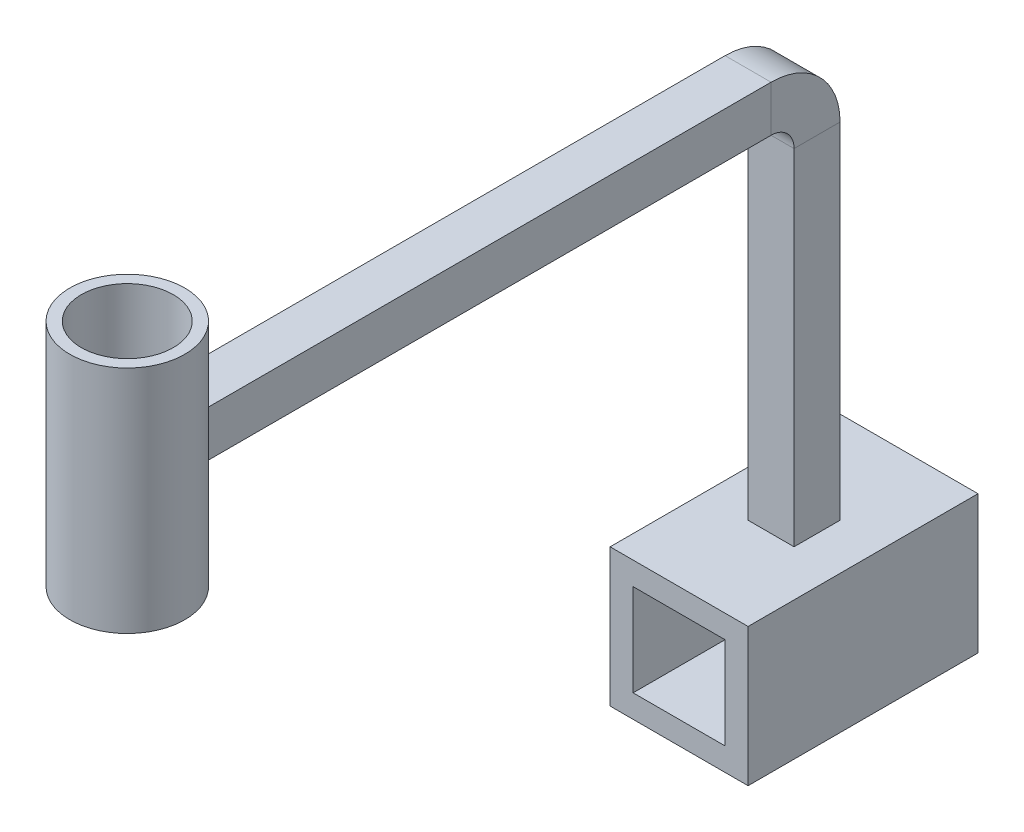
ISO-10303-21;
HEADER;
FILE_DESCRIPTION(('STEP AP214'),'2;1');
FILE_NAME('part.step','',(''),(''),'','','');
FILE_SCHEMA(('AUTOMOTIVE_DESIGN { 1 0 10303 214 1 1 1 1 }'));
ENDSEC;
DATA;
#1=APPLICATION_CONTEXT('core data for automotive mechanical design processes');
#2=APPLICATION_PROTOCOL_DEFINITION('international standard','automotive_design',2000,#1);
#3=PRODUCT_CONTEXT('',#1,'mechanical');
#4=PRODUCT('Part','Part','',(#3));
#5=PRODUCT_RELATED_PRODUCT_CATEGORY('part','',(#4));
#6=PRODUCT_DEFINITION_FORMATION('','',#4);
#7=PRODUCT_DEFINITION_CONTEXT('part definition',#1,'design');
#8=PRODUCT_DEFINITION('design','',#6,#7);
#9=PRODUCT_DEFINITION_SHAPE('','',#8);
#10=(LENGTH_UNIT() NAMED_UNIT(*) SI_UNIT(.MILLI.,.METRE.));
#11=(NAMED_UNIT(*) PLANE_ANGLE_UNIT() SI_UNIT($,.RADIAN.));
#12=(NAMED_UNIT(*) SI_UNIT($,.STERADIAN.) SOLID_ANGLE_UNIT());
#13=UNCERTAINTY_MEASURE_WITH_UNIT(LENGTH_MEASURE(1.E-05),#10,'distance_accuracy_value','');
#14=(GEOMETRIC_REPRESENTATION_CONTEXT(3) GLOBAL_UNCERTAINTY_ASSIGNED_CONTEXT((#13)) GLOBAL_UNIT_ASSIGNED_CONTEXT((#10,
#11,#12)) REPRESENTATION_CONTEXT('',''));
#15=CARTESIAN_POINT('',(0.,0.,0.));
#16=DIRECTION('',(0.,0.,1.));
#17=DIRECTION('',(1.,0.,0.));
#18=AXIS2_PLACEMENT_3D('',#15,#16,#17);
#19=CARTESIAN_POINT('',(-3.,3.,10.));
#20=DIRECTION('',(0.,-1.,0.));
#21=DIRECTION('',(0.,0.,-1.));
#22=AXIS2_PLACEMENT_3D('',#19,#20,#21);
#23=PLANE('',#22);
#24=DIRECTION('',(-1.,0.,0.));
#25=VECTOR('',#24,1.);
#26=CARTESIAN_POINT('',(-3.,3.,0.));
#27=LINE('',#26,#25);
#28=CARTESIAN_POINT('',(3.,3.,0.));
#29=VERTEX_POINT('',#28);
#30=CARTESIAN_POINT('',(-3.,3.,0.));
#31=VERTEX_POINT('',#30);
#32=EDGE_CURVE('E290',#29,#31,#27,.T.);
#33=ORIENTED_EDGE('',*,*,#32,.T.);
#34=DIRECTION('',(0.,0.,-1.));
#35=VECTOR('',#34,1.);
#36=CARTESIAN_POINT('',(-3.,3.,10.));
#37=LINE('',#36,#35);
#38=CARTESIAN_POINT('',(-3.,3.,10.));
#39=VERTEX_POINT('',#38);
#40=EDGE_CURVE('E300',#39,#31,#37,.T.);
#41=ORIENTED_EDGE('',*,*,#40,.F.);
#42=DIRECTION('',(-1.,0.,0.));
#43=VECTOR('',#42,1.);
#44=CARTESIAN_POINT('',(-3.,3.,10.));
#45=LINE('',#44,#43);
#46=CARTESIAN_POINT('',(3.,3.,10.));
#47=VERTEX_POINT('',#46);
#48=EDGE_CURVE('E280',#47,#39,#45,.T.);
#49=ORIENTED_EDGE('',*,*,#48,.F.);
#50=DIRECTION('',(0.,0.,-1.));
#51=VECTOR('',#50,1.);
#52=CARTESIAN_POINT('',(3.,3.,10.));
#53=LINE('',#52,#51);
#54=EDGE_CURVE('E53',#47,#29,#53,.T.);
#55=ORIENTED_EDGE('',*,*,#54,.T.);
#56=EDGE_LOOP('',(#33,#41,#49,#55));
#57=FACE_BOUND('',#56,.T.);
#58=DIRECTION('',(0.,0.,1.));
#59=VECTOR('',#58,1.);
#60=CARTESIAN_POINT('',(-0.999999999999999,3.,6.));
#61=LINE('',#60,#59);
#62=CARTESIAN_POINT('',(-0.999999999999999,3.,4.));
#63=VERTEX_POINT('',#62);
#64=CARTESIAN_POINT('',(-0.999999999999999,3.,6.));
#65=VERTEX_POINT('',#64);
#66=EDGE_CURVE('E212',#63,#65,#61,.T.);
#67=ORIENTED_EDGE('',*,*,#66,.F.);
#68=DIRECTION('',(-1.,0.,0.));
#69=VECTOR('',#68,1.);
#70=CARTESIAN_POINT('',(1.,3.,4.));
#71=LINE('',#70,#69);
#72=CARTESIAN_POINT('',(1.,3.,4.));
#73=VERTEX_POINT('',#72);
#74=EDGE_CURVE('E186',#73,#63,#71,.T.);
#75=ORIENTED_EDGE('',*,*,#74,.F.);
#76=DIRECTION('',(0.,0.,-1.));
#77=VECTOR('',#76,1.);
#78=CARTESIAN_POINT('',(1.,3.,6.));
#79=LINE('',#78,#77);
#80=CARTESIAN_POINT('',(1.,3.,6.));
#81=VERTEX_POINT('',#80);
#82=EDGE_CURVE('E172',#81,#73,#79,.T.);
#83=ORIENTED_EDGE('',*,*,#82,.F.);
#84=DIRECTION('',(1.,0.,0.));
#85=VECTOR('',#84,1.);
#86=CARTESIAN_POINT('',(1.,3.,6.));
#87=LINE('',#86,#85);
#88=EDGE_CURVE('E197',#65,#81,#87,.T.);
#89=ORIENTED_EDGE('',*,*,#88,.F.);
#90=EDGE_LOOP('',(#67,#75,#83,#89));
#91=FACE_BOUND('',#90,.T.);
#92=ADVANCED_FACE('F45',(#57,#91),#23,.F.);
#93=CARTESIAN_POINT('',(0.,0.,10.));
#94=DIRECTION('',(0.,0.,1.));
#95=DIRECTION('',(1.,0.,0.));
#96=AXIS2_PLACEMENT_3D('',#93,#94,#95);
#97=PLANE('',#96);
#98=DIRECTION('',(0.,1.,0.));
#99=VECTOR('',#98,1.);
#100=CARTESIAN_POINT('',(3.,3.,10.));
#101=LINE('',#100,#99);
#102=CARTESIAN_POINT('',(3.,-3.,10.));
#103=VERTEX_POINT('',#102);
#104=EDGE_CURVE('E277',#103,#47,#101,.T.);
#105=ORIENTED_EDGE('',*,*,#104,.T.);
#106=ORIENTED_EDGE('',*,*,#48,.T.);
#107=DIRECTION('',(0.,-1.,0.));
#108=VECTOR('',#107,1.);
#109=CARTESIAN_POINT('',(-3.,3.,10.));
#110=LINE('',#109,#108);
#111=CARTESIAN_POINT('',(-3.,-3.,10.));
#112=VERTEX_POINT('',#111);
#113=EDGE_CURVE('E283',#39,#112,#110,.T.);
#114=ORIENTED_EDGE('',*,*,#113,.T.);
#115=DIRECTION('',(1.,0.,0.));
#116=VECTOR('',#115,1.);
#117=CARTESIAN_POINT('',(-3.,-3.,10.));
#118=LINE('',#117,#116);
#119=EDGE_CURVE('E285',#112,#103,#118,.T.);
#120=ORIENTED_EDGE('',*,*,#119,.T.);
#121=EDGE_LOOP('',(#105,#106,#114,#120));
#122=FACE_BOUND('',#121,.T.);
#123=DIRECTION('',(-1.,0.,0.));
#124=VECTOR('',#123,1.);
#125=CARTESIAN_POINT('',(-2.,2.,10.));
#126=LINE('',#125,#124);
#127=CARTESIAN_POINT('',(2.,2.,10.));
#128=VERTEX_POINT('',#127);
#129=CARTESIAN_POINT('',(-2.,2.,10.));
#130=VERTEX_POINT('',#129);
#131=EDGE_CURVE('E248',#128,#130,#126,.T.);
#132=ORIENTED_EDGE('',*,*,#131,.F.);
#133=DIRECTION('',(0.,1.,0.));
#134=VECTOR('',#133,1.);
#135=CARTESIAN_POINT('',(2.,2.,10.));
#136=LINE('',#135,#134);
#137=CARTESIAN_POINT('',(2.,-2.,10.));
#138=VERTEX_POINT('',#137);
#139=EDGE_CURVE('E246',#138,#128,#136,.T.);
#140=ORIENTED_EDGE('',*,*,#139,.F.);
#141=DIRECTION('',(1.,0.,0.));
#142=VECTOR('',#141,1.);
#143=CARTESIAN_POINT('',(-2.,-2.,10.));
#144=LINE('',#143,#142);
#145=CARTESIAN_POINT('',(-2.,-2.,10.));
#146=VERTEX_POINT('',#145);
#147=EDGE_CURVE('E254',#146,#138,#144,.T.);
#148=ORIENTED_EDGE('',*,*,#147,.F.);
#149=DIRECTION('',(0.,-1.,0.));
#150=VECTOR('',#149,1.);
#151=CARTESIAN_POINT('',(-2.,2.,10.));
#152=LINE('',#151,#150);
#153=EDGE_CURVE('E251',#130,#146,#152,.T.);
#154=ORIENTED_EDGE('',*,*,#153,.F.);
#155=EDGE_LOOP('',(#132,#140,#148,#154));
#156=FACE_BOUND('',#155,.T.);
#157=ADVANCED_FACE('F324',(#122,#156),#97,.T.);
#158=CARTESIAN_POINT('',(0.,0.,0.));
#159=DIRECTION('',(0.,0.,1.));
#160=DIRECTION('',(1.,0.,0.));
#161=AXIS2_PLACEMENT_3D('',#158,#159,#160);
#162=PLANE('',#161);
#163=DIRECTION('',(0.,1.,0.));
#164=VECTOR('',#163,1.);
#165=CARTESIAN_POINT('',(3.,3.,0.));
#166=LINE('',#165,#164);
#167=CARTESIAN_POINT('',(3.,-3.,0.));
#168=VERTEX_POINT('',#167);
#169=EDGE_CURVE('E276',#168,#29,#166,.T.);
#170=ORIENTED_EDGE('',*,*,#169,.F.);
#171=DIRECTION('',(1.,0.,0.));
#172=VECTOR('',#171,1.);
#173=CARTESIAN_POINT('',(-3.,-3.,0.));
#174=LINE('',#173,#172);
#175=CARTESIAN_POINT('',(-3.,-3.,0.));
#176=VERTEX_POINT('',#175);
#177=EDGE_CURVE('E281',#176,#168,#174,.T.);
#178=ORIENTED_EDGE('',*,*,#177,.F.);
#179=DIRECTION('',(0.,-1.,0.));
#180=VECTOR('',#179,1.);
#181=CARTESIAN_POINT('',(-3.,3.,0.));
#182=LINE('',#181,#180);
#183=EDGE_CURVE('E292',#31,#176,#182,.T.);
#184=ORIENTED_EDGE('',*,*,#183,.F.);
#185=ORIENTED_EDGE('',*,*,#32,.F.);
#186=EDGE_LOOP('',(#170,#178,#184,#185));
#187=FACE_BOUND('',#186,.T.);
#188=DIRECTION('',(0.,1.,0.));
#189=VECTOR('',#188,1.);
#190=CARTESIAN_POINT('',(2.,2.,0.));
#191=LINE('',#190,#189);
#192=CARTESIAN_POINT('',(2.,-2.,0.));
#193=VERTEX_POINT('',#192);
#194=CARTESIAN_POINT('',(2.,2.,0.));
#195=VERTEX_POINT('',#194);
#196=EDGE_CURVE('E240',#193,#195,#191,.T.);
#197=ORIENTED_EDGE('',*,*,#196,.T.);
#198=DIRECTION('',(-1.,0.,0.));
#199=VECTOR('',#198,1.);
#200=CARTESIAN_POINT('',(-2.,2.,0.));
#201=LINE('',#200,#199);
#202=CARTESIAN_POINT('',(-2.,2.,0.));
#203=VERTEX_POINT('',#202);
#204=EDGE_CURVE('E259',#195,#203,#201,.T.);
#205=ORIENTED_EDGE('',*,*,#204,.T.);
#206=DIRECTION('',(0.,-1.,0.));
#207=VECTOR('',#206,1.);
#208=CARTESIAN_POINT('',(-2.,2.,0.));
#209=LINE('',#208,#207);
#210=CARTESIAN_POINT('',(-2.,-2.,0.));
#211=VERTEX_POINT('',#210);
#212=EDGE_CURVE('E262',#203,#211,#209,.T.);
#213=ORIENTED_EDGE('',*,*,#212,.T.);
#214=DIRECTION('',(1.,0.,0.));
#215=VECTOR('',#214,1.);
#216=CARTESIAN_POINT('',(-2.,-2.,0.));
#217=LINE('',#216,#215);
#218=EDGE_CURVE('E249',#211,#193,#217,.T.);
#219=ORIENTED_EDGE('',*,*,#218,.T.);
#220=EDGE_LOOP('',(#197,#205,#213,#219));
#221=FACE_BOUND('',#220,.T.);
#222=ADVANCED_FACE('F313',(#187,#221),#162,.F.);
#223=CARTESIAN_POINT('',(3.,3.,10.));
#224=DIRECTION('',(-1.,0.,0.));
#225=DIRECTION('',(0.,-1.,0.));
#226=AXIS2_PLACEMENT_3D('',#223,#224,#225);
#227=PLANE('',#226);
#228=ORIENTED_EDGE('',*,*,#169,.T.);
#229=ORIENTED_EDGE('',*,*,#54,.F.);
#230=ORIENTED_EDGE('',*,*,#104,.F.);
#231=DIRECTION('',(0.,0.,-1.));
#232=VECTOR('',#231,1.);
#233=CARTESIAN_POINT('',(3.,-3.,10.));
#234=LINE('',#233,#232);
#235=EDGE_CURVE('E287',#103,#168,#234,.T.);
#236=ORIENTED_EDGE('',*,*,#235,.T.);
#237=EDGE_LOOP('',(#228,#229,#230,#236));
#238=FACE_BOUND('',#237,.T.);
#239=ADVANCED_FACE('F47',(#238),#227,.F.);
#240=CARTESIAN_POINT('',(-3.,3.,10.));
#241=DIRECTION('',(1.,0.,0.));
#242=DIRECTION('',(0.,1.,0.));
#243=AXIS2_PLACEMENT_3D('',#240,#241,#242);
#244=PLANE('',#243);
#245=ORIENTED_EDGE('',*,*,#183,.T.);
#246=DIRECTION('',(0.,0.,-1.));
#247=VECTOR('',#246,1.);
#248=CARTESIAN_POINT('',(-3.,-3.,10.));
#249=LINE('',#248,#247);
#250=EDGE_CURVE('E297',#112,#176,#249,.T.);
#251=ORIENTED_EDGE('',*,*,#250,.F.);
#252=ORIENTED_EDGE('',*,*,#113,.F.);
#253=ORIENTED_EDGE('',*,*,#40,.T.);
#254=EDGE_LOOP('',(#245,#251,#252,#253));
#255=FACE_BOUND('',#254,.T.);
#256=ADVANCED_FACE('F318',(#255),#244,.F.);
#257=CARTESIAN_POINT('',(-3.,-3.,10.));
#258=DIRECTION('',(0.,1.,0.));
#259=DIRECTION('',(0.,0.,1.));
#260=AXIS2_PLACEMENT_3D('',#257,#258,#259);
#261=PLANE('',#260);
#262=ORIENTED_EDGE('',*,*,#177,.T.);
#263=ORIENTED_EDGE('',*,*,#235,.F.);
#264=ORIENTED_EDGE('',*,*,#119,.F.);
#265=ORIENTED_EDGE('',*,*,#250,.T.);
#266=EDGE_LOOP('',(#262,#263,#264,#265));
#267=FACE_BOUND('',#266,.T.);
#268=ADVANCED_FACE('F322',(#267),#261,.F.);
#269=CARTESIAN_POINT('',(2.,2.,10.));
#270=DIRECTION('',(-1.,0.,0.));
#271=DIRECTION('',(0.,-1.,0.));
#272=AXIS2_PLACEMENT_3D('',#269,#270,#271);
#273=PLANE('',#272);
#274=ORIENTED_EDGE('',*,*,#196,.F.);
#275=DIRECTION('',(0.,0.,-1.));
#276=VECTOR('',#275,1.);
#277=CARTESIAN_POINT('',(2.,-2.,10.));
#278=LINE('',#277,#276);
#279=EDGE_CURVE('E256',#138,#193,#278,.T.);
#280=ORIENTED_EDGE('',*,*,#279,.F.);
#281=ORIENTED_EDGE('',*,*,#139,.T.);
#282=DIRECTION('',(0.,0.,-1.));
#283=VECTOR('',#282,1.);
#284=CARTESIAN_POINT('',(2.,2.,10.));
#285=LINE('',#284,#283);
#286=EDGE_CURVE('E273',#128,#195,#285,.T.);
#287=ORIENTED_EDGE('',*,*,#286,.T.);
#288=EDGE_LOOP('',(#274,#280,#281,#287));
#289=FACE_BOUND('',#288,.T.);
#290=ADVANCED_FACE('F341',(#289),#273,.T.);
#291=CARTESIAN_POINT('',(-2.,2.,10.));
#292=DIRECTION('',(0.,-1.,0.));
#293=DIRECTION('',(0.,0.,-1.));
#294=AXIS2_PLACEMENT_3D('',#291,#292,#293);
#295=PLANE('',#294);
#296=ORIENTED_EDGE('',*,*,#204,.F.);
#297=ORIENTED_EDGE('',*,*,#286,.F.);
#298=ORIENTED_EDGE('',*,*,#131,.T.);
#299=DIRECTION('',(0.,0.,-1.));
#300=VECTOR('',#299,1.);
#301=CARTESIAN_POINT('',(-2.,2.,10.));
#302=LINE('',#301,#300);
#303=EDGE_CURVE('E271',#130,#203,#302,.T.);
#304=ORIENTED_EDGE('',*,*,#303,.T.);
#305=EDGE_LOOP('',(#296,#297,#298,#304));
#306=FACE_BOUND('',#305,.T.);
#307=ADVANCED_FACE('F335',(#306),#295,.T.);
#308=CARTESIAN_POINT('',(-2.,2.,10.));
#309=DIRECTION('',(1.,0.,0.));
#310=DIRECTION('',(0.,1.,0.));
#311=AXIS2_PLACEMENT_3D('',#308,#309,#310);
#312=PLANE('',#311);
#313=ORIENTED_EDGE('',*,*,#212,.F.);
#314=ORIENTED_EDGE('',*,*,#303,.F.);
#315=ORIENTED_EDGE('',*,*,#153,.T.);
#316=DIRECTION('',(0.,0.,-1.));
#317=VECTOR('',#316,1.);
#318=CARTESIAN_POINT('',(-2.,-2.,10.));
#319=LINE('',#318,#317);
#320=EDGE_CURVE('E269',#146,#211,#319,.T.);
#321=ORIENTED_EDGE('',*,*,#320,.T.);
#322=EDGE_LOOP('',(#313,#314,#315,#321));
#323=FACE_BOUND('',#322,.T.);
#324=ADVANCED_FACE('F338',(#323),#312,.T.);
#325=CARTESIAN_POINT('',(-2.,-2.,10.));
#326=DIRECTION('',(0.,1.,0.));
#327=DIRECTION('',(0.,0.,1.));
#328=AXIS2_PLACEMENT_3D('',#325,#326,#327);
#329=PLANE('',#328);
#330=ORIENTED_EDGE('',*,*,#218,.F.);
#331=ORIENTED_EDGE('',*,*,#320,.F.);
#332=ORIENTED_EDGE('',*,*,#147,.T.);
#333=ORIENTED_EDGE('',*,*,#279,.T.);
#334=EDGE_LOOP('',(#330,#331,#332,#333));
#335=FACE_BOUND('',#334,.T.);
#336=ADVANCED_FACE('F344',(#335),#329,.T.);
#337=CARTESIAN_POINT('',(1.,3.,6.));
#338=DIRECTION('',(1.,0.,0.));
#339=DIRECTION('',(0.,0.,-1.));
#340=AXIS2_PLACEMENT_3D('',#337,#338,#339);
#341=PLANE('',#340);
#342=DIRECTION('',(0.,1.,0.));
#343=VECTOR('',#342,1.);
#344=CARTESIAN_POINT('',(1.,3.,4.));
#345=LINE('',#344,#343);
#346=CARTESIAN_POINT('',(1.,18.,4.));
#347=VERTEX_POINT('',#346);
#348=EDGE_CURVE('E190',#73,#347,#345,.T.);
#349=ORIENTED_EDGE('',*,*,#348,.T.);
#350=DIRECTION('',(0.,0.,-1.));
#351=VECTOR('',#350,1.);
#352=CARTESIAN_POINT('',(1.,18.,6.));
#353=LINE('',#352,#351);
#354=CARTESIAN_POINT('',(1.,18.,6.));
#355=VERTEX_POINT('',#354);
#356=EDGE_CURVE('E187',#355,#347,#353,.T.);
#357=ORIENTED_EDGE('',*,*,#356,.F.);
#358=DIRECTION('',(0.,1.,0.));
#359=VECTOR('',#358,1.);
#360=CARTESIAN_POINT('',(1.,3.,6.));
#361=LINE('',#360,#359);
#362=EDGE_CURVE('E191',#81,#355,#361,.T.);
#363=ORIENTED_EDGE('',*,*,#362,.F.);
#364=ORIENTED_EDGE('',*,*,#82,.T.);
#365=EDGE_LOOP('',(#349,#357,#363,#364));
#366=FACE_BOUND('',#365,.T.);
#367=ADVANCED_FACE('F346',(#366),#341,.T.);
#368=CARTESIAN_POINT('',(1.,3.,4.));
#369=DIRECTION('',(0.,0.,-1.));
#370=DIRECTION('',(0.,1.,0.));
#371=AXIS2_PLACEMENT_3D('',#368,#369,#370);
#372=PLANE('',#371);
#373=DIRECTION('',(0.,1.,0.));
#374=VECTOR('',#373,1.);
#375=CARTESIAN_POINT('',(-0.999999999999999,3.,4.));
#376=LINE('',#375,#374);
#377=CARTESIAN_POINT('',(-0.999999999999999,18.,4.));
#378=VERTEX_POINT('',#377);
#379=EDGE_CURVE('E215',#63,#378,#376,.T.);
#380=ORIENTED_EDGE('',*,*,#379,.T.);
#381=DIRECTION('',(-1.,0.,0.));
#382=VECTOR('',#381,1.);
#383=CARTESIAN_POINT('',(1.,18.,4.));
#384=LINE('',#383,#382);
#385=EDGE_CURVE('E194',#347,#378,#384,.T.);
#386=ORIENTED_EDGE('',*,*,#385,.F.);
#387=ORIENTED_EDGE('',*,*,#348,.F.);
#388=ORIENTED_EDGE('',*,*,#74,.T.);
#389=EDGE_LOOP('',(#380,#386,#387,#388));
#390=FACE_BOUND('',#389,.T.);
#391=ADVANCED_FACE('F352',(#390),#372,.T.);
#392=CARTESIAN_POINT('',(-0.999999999999999,3.,6.));
#393=DIRECTION('',(-1.,0.,0.));
#394=DIRECTION('',(0.,0.,1.));
#395=AXIS2_PLACEMENT_3D('',#392,#393,#394);
#396=PLANE('',#395);
#397=DIRECTION('',(0.,1.,0.));
#398=VECTOR('',#397,1.);
#399=CARTESIAN_POINT('',(-0.999999999999999,3.,6.));
#400=LINE('',#399,#398);
#401=CARTESIAN_POINT('',(-0.999999999999999,18.,6.));
#402=VERTEX_POINT('',#401);
#403=EDGE_CURVE('E231',#65,#402,#400,.T.);
#404=ORIENTED_EDGE('',*,*,#403,.T.);
#405=DIRECTION('',(0.,0.,1.));
#406=VECTOR('',#405,1.);
#407=CARTESIAN_POINT('',(-0.999999999999999,18.,6.));
#408=LINE('',#407,#406);
#409=EDGE_CURVE('E218',#378,#402,#408,.T.);
#410=ORIENTED_EDGE('',*,*,#409,.F.);
#411=ORIENTED_EDGE('',*,*,#379,.F.);
#412=ORIENTED_EDGE('',*,*,#66,.T.);
#413=EDGE_LOOP('',(#404,#410,#411,#412));
#414=FACE_BOUND('',#413,.T.);
#415=ADVANCED_FACE('F403',(#414),#396,.T.);
#416=CARTESIAN_POINT('',(1.,3.,6.));
#417=DIRECTION('',(0.,0.,1.));
#418=DIRECTION('',(0.,-1.,0.));
#419=AXIS2_PLACEMENT_3D('',#416,#417,#418);
#420=PLANE('',#419);
#421=DIRECTION('',(1.,0.,0.));
#422=VECTOR('',#421,1.);
#423=CARTESIAN_POINT('',(1.,18.,6.));
#424=LINE('',#423,#422);
#425=EDGE_CURVE('E207',#402,#355,#424,.T.);
#426=ORIENTED_EDGE('',*,*,#425,.F.);
#427=ORIENTED_EDGE('',*,*,#403,.F.);
#428=ORIENTED_EDGE('',*,*,#88,.T.);
#429=ORIENTED_EDGE('',*,*,#362,.T.);
#430=EDGE_LOOP('',(#426,#427,#428,#429));
#431=FACE_BOUND('',#430,.T.);
#432=ADVANCED_FACE('F413',(#431),#420,.T.);
#433=CARTESIAN_POINT('',(1.,18.,6.));
#434=DIRECTION('',(1.,0.,0.));
#435=DIRECTION('',(0.,0.,-1.));
#436=AXIS2_PLACEMENT_3D('',#433,#434,#435);
#437=PLANE('',#436);
#438=CARTESIAN_POINT('',(1.,18.,7.));
#439=DIRECTION('',(1.,0.,0.));
#440=DIRECTION('',(0.,0.,-1.));
#441=AXIS2_PLACEMENT_3D('',#438,#439,#440);
#442=CIRCLE('',#441,3.);
#443=CARTESIAN_POINT('',(1.,21.,7.));
#444=VERTEX_POINT('',#443);
#445=EDGE_CURVE('E200',#347,#444,#442,.T.);
#446=ORIENTED_EDGE('',*,*,#445,.T.);
#447=DIRECTION('',(0.,1.,0.));
#448=VECTOR('',#447,1.);
#449=CARTESIAN_POINT('',(1.,19.,7.));
#450=LINE('',#449,#448);
#451=CARTESIAN_POINT('',(1.,19.,7.));
#452=VERTEX_POINT('',#451);
#453=EDGE_CURVE('E198',#452,#444,#450,.T.);
#454=ORIENTED_EDGE('',*,*,#453,.F.);
#455=CARTESIAN_POINT('',(1.,18.,7.));
#456=DIRECTION('',(1.,0.,0.));
#457=DIRECTION('',(0.,0.,-1.));
#458=AXIS2_PLACEMENT_3D('',#455,#456,#457);
#459=CIRCLE('',#458,1.);
#460=EDGE_CURVE('E201',#355,#452,#459,.T.);
#461=ORIENTED_EDGE('',*,*,#460,.F.);
#462=ORIENTED_EDGE('',*,*,#356,.T.);
#463=EDGE_LOOP('',(#446,#454,#461,#462));
#464=FACE_BOUND('',#463,.T.);
#465=ADVANCED_FACE('F423',(#464),#437,.T.);
#466=CARTESIAN_POINT('',(0.,18.,7.));
#467=DIRECTION('',(1.,0.,0.));
#468=DIRECTION('',(0.,0.,-1.));
#469=AXIS2_PLACEMENT_3D('',#466,#467,#468);
#470=CYLINDRICAL_SURFACE('',#469,3.);
#471=CARTESIAN_POINT('',(-0.999999999999999,18.,7.));
#472=DIRECTION('',(1.,0.,0.));
#473=DIRECTION('',(0.,0.,-1.));
#474=AXIS2_PLACEMENT_3D('',#471,#472,#473);
#475=CIRCLE('',#474,3.);
#476=CARTESIAN_POINT('',(-0.999999999999999,21.,7.));
#477=VERTEX_POINT('',#476);
#478=EDGE_CURVE('E221',#378,#477,#475,.T.);
#479=ORIENTED_EDGE('',*,*,#478,.T.);
#480=DIRECTION('',(-1.,0.,0.));
#481=VECTOR('',#480,1.);
#482=CARTESIAN_POINT('',(1.,21.,7.));
#483=LINE('',#482,#481);
#484=EDGE_CURVE('E204',#444,#477,#483,.T.);
#485=ORIENTED_EDGE('',*,*,#484,.F.);
#486=ORIENTED_EDGE('',*,*,#445,.F.);
#487=ORIENTED_EDGE('',*,*,#385,.T.);
#488=EDGE_LOOP('',(#479,#485,#486,#487));
#489=FACE_BOUND('',#488,.T.);
#490=ADVANCED_FACE('F433',(#489),#470,.T.);
#491=CARTESIAN_POINT('',(-0.999999999999999,18.,6.));
#492=DIRECTION('',(-1.,0.,0.));
#493=DIRECTION('',(0.,0.,1.));
#494=AXIS2_PLACEMENT_3D('',#491,#492,#493);
#495=PLANE('',#494);
#496=CARTESIAN_POINT('',(-0.999999999999999,18.,7.));
#497=DIRECTION('',(1.,0.,0.));
#498=DIRECTION('',(0.,0.,-1.));
#499=AXIS2_PLACEMENT_3D('',#496,#497,#498);
#500=CIRCLE('',#499,1.);
#501=CARTESIAN_POINT('',(-0.999999999999999,19.,7.));
#502=VERTEX_POINT('',#501);
#503=EDGE_CURVE('E236',#402,#502,#500,.T.);
#504=ORIENTED_EDGE('',*,*,#503,.T.);
#505=DIRECTION('',(0.,-1.,0.));
#506=VECTOR('',#505,1.);
#507=CARTESIAN_POINT('',(-0.999999999999999,19.,7.));
#508=LINE('',#507,#506);
#509=EDGE_CURVE('E224',#477,#502,#508,.T.);
#510=ORIENTED_EDGE('',*,*,#509,.F.);
#511=ORIENTED_EDGE('',*,*,#478,.F.);
#512=ORIENTED_EDGE('',*,*,#409,.T.);
#513=EDGE_LOOP('',(#504,#510,#511,#512));
#514=FACE_BOUND('',#513,.T.);
#515=ADVANCED_FACE('F443',(#514),#495,.T.);
#516=CARTESIAN_POINT('',(0.,18.,7.));
#517=DIRECTION('',(1.,0.,0.));
#518=DIRECTION('',(0.,0.,-1.));
#519=AXIS2_PLACEMENT_3D('',#516,#517,#518);
#520=CYLINDRICAL_SURFACE('',#519,1.);
#521=DIRECTION('',(1.,0.,0.));
#522=VECTOR('',#521,1.);
#523=CARTESIAN_POINT('',(1.,19.,7.));
#524=LINE('',#523,#522);
#525=EDGE_CURVE('E162',#502,#452,#524,.T.);
#526=ORIENTED_EDGE('',*,*,#525,.F.);
#527=ORIENTED_EDGE('',*,*,#503,.F.);
#528=ORIENTED_EDGE('',*,*,#425,.T.);
#529=ORIENTED_EDGE('',*,*,#460,.T.);
#530=EDGE_LOOP('',(#526,#527,#528,#529));
#531=FACE_BOUND('',#530,.T.);
#532=ADVANCED_FACE('F453',(#531),#520,.F.);
#533=CARTESIAN_POINT('',(1.,19.,7.));
#534=DIRECTION('',(1.,0.,0.));
#535=DIRECTION('',(0.,0.,-1.));
#536=AXIS2_PLACEMENT_3D('',#533,#534,#535);
#537=PLANE('',#536);
#538=DIRECTION('',(0.,-1.,0.));
#539=VECTOR('',#538,1.);
#540=CARTESIAN_POINT('',(1.,25.,31.7087121525221));
#541=LINE('',#540,#539);
#542=CARTESIAN_POINT('',(1.,19.,31.7087121525221));
#543=VERTEX_POINT('',#542);
#544=CARTESIAN_POINT('',(1.,21.,31.7087121525221));
#545=VERTEX_POINT('',#544);
#546=EDGE_CURVE('E169',#543,#545,#541,.F.);
#547=ORIENTED_EDGE('',*,*,#546,.F.);
#548=DIRECTION('',(0.,0.,1.));
#549=VECTOR('',#548,1.);
#550=CARTESIAN_POINT('',(1.,19.,7.));
#551=LINE('',#550,#549);
#552=EDGE_CURVE('E158',#452,#543,#551,.T.);
#553=ORIENTED_EDGE('',*,*,#552,.F.);
#554=ORIENTED_EDGE('',*,*,#453,.T.);
#555=DIRECTION('',(0.,0.,1.));
#556=VECTOR('',#555,1.);
#557=CARTESIAN_POINT('',(1.,21.,7.));
#558=LINE('',#557,#556);
#559=EDGE_CURVE('E166',#444,#545,#558,.T.);
#560=ORIENTED_EDGE('',*,*,#559,.T.);
#561=EDGE_LOOP('',(#547,#553,#554,#560));
#562=FACE_BOUND('',#561,.T.);
#563=ADVANCED_FACE('F170',(#562),#537,.T.);
#564=CARTESIAN_POINT('',(1.,21.,7.));
#565=DIRECTION('',(0.,1.,0.));
#566=DIRECTION('',(0.,0.,1.));
#567=AXIS2_PLACEMENT_3D('',#564,#565,#566);
#568=PLANE('',#567);
#569=CARTESIAN_POINT('',(0.,21.,34.));
#570=DIRECTION('',(0.,1.,0.));
#571=DIRECTION('',(0.,0.,1.));
#572=AXIS2_PLACEMENT_3D('',#569,#570,#571);
#573=CIRCLE('',#572,2.5);
#574=CARTESIAN_POINT('',(-0.999999999999999,21.,31.7087121525221));
#575=VERTEX_POINT('',#574);
#576=EDGE_CURVE('E60',#545,#575,#573,.T.);
#577=ORIENTED_EDGE('',*,*,#576,.F.);
#578=ORIENTED_EDGE('',*,*,#559,.F.);
#579=ORIENTED_EDGE('',*,*,#484,.T.);
#580=DIRECTION('',(0.,0.,1.));
#581=VECTOR('',#580,1.);
#582=CARTESIAN_POINT('',(-0.999999999999999,21.,7.));
#583=LINE('',#582,#581);
#584=EDGE_CURVE('E208',#477,#575,#583,.T.);
#585=ORIENTED_EDGE('',*,*,#584,.T.);
#586=EDGE_LOOP('',(#577,#578,#579,#585));
#587=FACE_BOUND('',#586,.T.);
#588=ADVANCED_FACE('F472',(#587),#568,.T.);
#589=CARTESIAN_POINT('',(-0.999999999999999,19.,7.));
#590=DIRECTION('',(-1.,0.,0.));
#591=DIRECTION('',(0.,0.,1.));
#592=AXIS2_PLACEMENT_3D('',#589,#590,#591);
#593=PLANE('',#592);
#594=DIRECTION('',(0.,-1.,0.));
#595=VECTOR('',#594,1.);
#596=CARTESIAN_POINT('',(-0.999999999999999,25.,31.7087121525221));
#597=LINE('',#596,#595);
#598=CARTESIAN_POINT('',(-0.999999999999999,19.,31.7087121525221));
#599=VERTEX_POINT('',#598);
#600=EDGE_CURVE('E68',#575,#599,#597,.T.);
#601=ORIENTED_EDGE('',*,*,#600,.F.);
#602=ORIENTED_EDGE('',*,*,#584,.F.);
#603=ORIENTED_EDGE('',*,*,#509,.T.);
#604=DIRECTION('',(0.,0.,1.));
#605=VECTOR('',#604,1.);
#606=CARTESIAN_POINT('',(-0.999999999999999,19.,7.));
#607=LINE('',#606,#605);
#608=EDGE_CURVE('E226',#502,#599,#607,.T.);
#609=ORIENTED_EDGE('',*,*,#608,.T.);
#610=EDGE_LOOP('',(#601,#602,#603,#609));
#611=FACE_BOUND('',#610,.T.);
#612=ADVANCED_FACE('F358',(#611),#593,.T.);
#613=CARTESIAN_POINT('',(1.,19.,7.));
#614=DIRECTION('',(0.,-1.,0.));
#615=DIRECTION('',(0.,0.,-1.));
#616=AXIS2_PLACEMENT_3D('',#613,#614,#615);
#617=PLANE('',#616);
#618=CARTESIAN_POINT('',(0.,19.,34.));
#619=DIRECTION('',(0.,-1.,0.));
#620=DIRECTION('',(0.,0.,-1.));
#621=AXIS2_PLACEMENT_3D('',#618,#619,#620);
#622=CIRCLE('',#621,2.5);
#623=EDGE_CURVE('E12',#599,#543,#622,.T.);
#624=ORIENTED_EDGE('',*,*,#623,.F.);
#625=ORIENTED_EDGE('',*,*,#608,.F.);
#626=ORIENTED_EDGE('',*,*,#525,.T.);
#627=ORIENTED_EDGE('',*,*,#552,.T.);
#628=EDGE_LOOP('',(#624,#625,#626,#627));
#629=FACE_BOUND('',#628,.T.);
#630=ADVANCED_FACE('F160',(#629),#617,.T.);
#631=CARTESIAN_POINT('',(0.,25.,34.));
#632=DIRECTION('',(0.,-1.,0.));
#633=DIRECTION('',(0.,0.,-1.));
#634=AXIS2_PLACEMENT_3D('',#631,#632,#633);
#635=CYLINDRICAL_SURFACE('',#634,2.5);
#636=ORIENTED_EDGE('',*,*,#623,.T.);
#637=ORIENTED_EDGE('',*,*,#546,.T.);
#638=ORIENTED_EDGE('',*,*,#576,.T.);
#639=ORIENTED_EDGE('',*,*,#600,.T.);
#640=EDGE_LOOP('',(#636,#637,#638,#639));
#641=FACE_BOUND('',#640,.T.);
#642=CARTESIAN_POINT('',(0.,25.,34.));
#643=DIRECTION('',(0.,-1.,0.));
#644=DIRECTION('',(0.,0.,-1.));
#645=AXIS2_PLACEMENT_3D('',#642,#643,#644);
#646=CIRCLE('',#645,2.5);
#647=CARTESIAN_POINT('',(0.,25.,31.5));
#648=VERTEX_POINT('',#647);
#649=EDGE_CURVE('E176',#648,#648,#646,.T.);
#650=ORIENTED_EDGE('',*,*,#649,.T.);
#651=EDGE_LOOP('',(#650));
#652=FACE_BOUND('',#651,.T.);
#653=CARTESIAN_POINT('',(0.,15.,34.));
#654=DIRECTION('',(0.,-1.,0.));
#655=DIRECTION('',(0.,0.,-1.));
#656=AXIS2_PLACEMENT_3D('',#653,#654,#655);
#657=CIRCLE('',#656,2.5);
#658=CARTESIAN_POINT('',(0.,15.,31.5));
#659=VERTEX_POINT('',#658);
#660=EDGE_CURVE('E539',#659,#659,#657,.T.);
#661=ORIENTED_EDGE('',*,*,#660,.F.);
#662=EDGE_LOOP('',(#661));
#663=FACE_BOUND('',#662,.T.);
#664=ADVANCED_FACE('F174',(#641,#652,#663),#635,.T.);
#665=CARTESIAN_POINT('',(0.,25.,34.));
#666=DIRECTION('',(0.,-1.,0.));
#667=DIRECTION('',(0.,0.,-1.));
#668=AXIS2_PLACEMENT_3D('',#665,#666,#667);
#669=PLANE('',#668);
#670=CARTESIAN_POINT('',(0.,25.,34.));
#671=DIRECTION('',(0.,-1.,0.));
#672=DIRECTION('',(0.,0.,-1.));
#673=AXIS2_PLACEMENT_3D('',#670,#671,#672);
#674=CIRCLE('',#673,2.);
#675=CARTESIAN_POINT('',(0.,25.,32.));
#676=VERTEX_POINT('',#675);
#677=EDGE_CURVE('E180',#676,#676,#674,.T.);
#678=ORIENTED_EDGE('',*,*,#677,.T.);
#679=EDGE_LOOP('',(#678));
#680=FACE_BOUND('',#679,.T.);
#681=ORIENTED_EDGE('',*,*,#649,.F.);
#682=EDGE_LOOP('',(#681));
#683=FACE_BOUND('',#682,.T.);
#684=ADVANCED_FACE('F503',(#680,#683),#669,.F.);
#685=CARTESIAN_POINT('',(0.,25.,34.));
#686=DIRECTION('',(0.,-1.,0.));
#687=DIRECTION('',(0.,0.,-1.));
#688=AXIS2_PLACEMENT_3D('',#685,#686,#687);
#689=CYLINDRICAL_SURFACE('',#688,2.);
#690=ORIENTED_EDGE('',*,*,#677,.F.);
#691=EDGE_LOOP('',(#690));
#692=FACE_BOUND('',#691,.T.);
#693=CARTESIAN_POINT('',(0.,15.,34.));
#694=DIRECTION('',(0.,-1.,0.));
#695=DIRECTION('',(0.,0.,-1.));
#696=AXIS2_PLACEMENT_3D('',#693,#694,#695);
#697=CIRCLE('',#696,2.);
#698=CARTESIAN_POINT('',(0.,15.,32.));
#699=VERTEX_POINT('',#698);
#700=EDGE_CURVE('E542',#699,#699,#697,.T.);
#701=ORIENTED_EDGE('',*,*,#700,.T.);
#702=EDGE_LOOP('',(#701));
#703=FACE_BOUND('',#702,.T.);
#704=ADVANCED_FACE('F512',(#692,#703),#689,.F.);
#705=CARTESIAN_POINT('',(0.,15.,34.));
#706=DIRECTION('',(0.,-1.,0.));
#707=DIRECTION('',(0.,0.,-1.));
#708=AXIS2_PLACEMENT_3D('',#705,#706,#707);
#709=PLANE('',#708);
#710=ORIENTED_EDGE('',*,*,#660,.T.);
#711=EDGE_LOOP('',(#710));
#712=FACE_BOUND('',#711,.T.);
#713=ORIENTED_EDGE('',*,*,#700,.F.);
#714=EDGE_LOOP('',(#713));
#715=FACE_BOUND('',#714,.T.);
#716=ADVANCED_FACE('F522',(#712,#715),#709,.T.);
#717=CLOSED_SHELL('',(#92,#157,#222,#239,#256,#268,#290,#307,#324,#336,#367,#391,#415,#432,#465,
#490,#515,#532,#563,#588,#612,#630,#664,#684,#704,#716));
#718=MANIFOLD_SOLID_BREP('B2',#717);
#719=ADVANCED_BREP_SHAPE_REPRESENTATION('',(#18,#718),#14);
#720=SHAPE_DEFINITION_REPRESENTATION(#9,#719);
ENDSEC;
END-ISO-10303-21;
